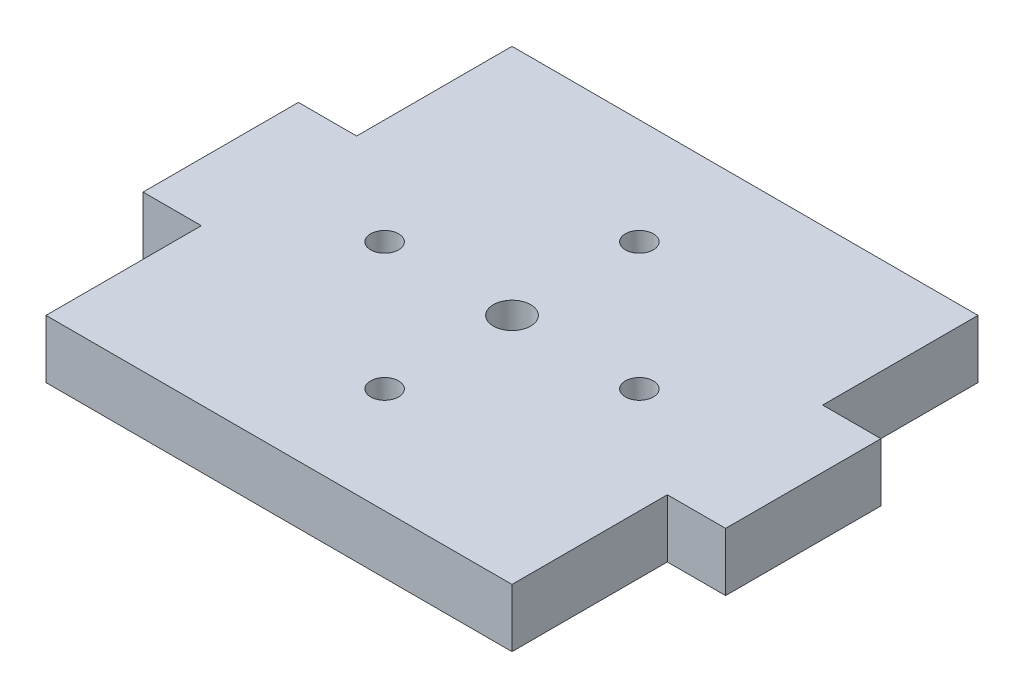
ISO-10303-21;
HEADER;
FILE_DESCRIPTION(('STEP AP214'),'2;1');
FILE_NAME('part.step','',(''),(''),'','','');
FILE_SCHEMA(('AUTOMOTIVE_DESIGN { 1 0 10303 214 1 1 1 1 }'));
ENDSEC;
DATA;
#1=APPLICATION_CONTEXT('core data for automotive mechanical design processes');
#2=APPLICATION_PROTOCOL_DEFINITION('international standard','automotive_design',2000,#1);
#3=PRODUCT_CONTEXT('',#1,'mechanical');
#4=PRODUCT('Part','Part','',(#3));
#5=PRODUCT_RELATED_PRODUCT_CATEGORY('part','',(#4));
#6=PRODUCT_DEFINITION_FORMATION('','',#4);
#7=PRODUCT_DEFINITION_CONTEXT('part definition',#1,'design');
#8=PRODUCT_DEFINITION('design','',#6,#7);
#9=PRODUCT_DEFINITION_SHAPE('','',#8);
#10=(LENGTH_UNIT() NAMED_UNIT(*) SI_UNIT(.MILLI.,.METRE.));
#11=(NAMED_UNIT(*) PLANE_ANGLE_UNIT() SI_UNIT($,.RADIAN.));
#12=(NAMED_UNIT(*) SI_UNIT($,.STERADIAN.) SOLID_ANGLE_UNIT());
#13=UNCERTAINTY_MEASURE_WITH_UNIT(LENGTH_MEASURE(1.E-05),#10,'distance_accuracy_value','');
#14=(GEOMETRIC_REPRESENTATION_CONTEXT(3) GLOBAL_UNCERTAINTY_ASSIGNED_CONTEXT((#13)) GLOBAL_UNIT_ASSIGNED_CONTEXT((#10,
#11,#12)) REPRESENTATION_CONTEXT('',''));
#15=CARTESIAN_POINT('',(0.,0.,0.));
#16=DIRECTION('',(0.,0.,1.));
#17=DIRECTION('',(1.,0.,0.));
#18=AXIS2_PLACEMENT_3D('',#15,#16,#17);
#19=CARTESIAN_POINT('',(0.,4.7625,0.));
#20=DIRECTION('',(0.,-1.,0.));
#21=DIRECTION('',(0.,0.,-1.));
#22=AXIS2_PLACEMENT_3D('',#19,#20,#21);
#23=PLANE('',#22);
#24=DIRECTION('',(1.,0.,0.));
#25=VECTOR('',#24,1.);
#26=CARTESIAN_POINT('',(38.1,4.7625,0.));
#27=LINE('',#26,#25);
#28=CARTESIAN_POINT('',(0.,4.7625,0.));
#29=VERTEX_POINT('',#28);
#30=CARTESIAN_POINT('',(38.1,4.7625,0.));
#31=VERTEX_POINT('',#30);
#32=EDGE_CURVE('E177',#29,#31,#27,.T.);
#33=ORIENTED_EDGE('',*,*,#32,.T.);
#34=DIRECTION('',(0.,0.,-1.));
#35=VECTOR('',#34,1.);
#36=CARTESIAN_POINT('',(38.1,4.7625,-12.7));
#37=LINE('',#36,#35);
#38=CARTESIAN_POINT('',(38.1,4.7625,-12.7));
#39=VERTEX_POINT('',#38);
#40=EDGE_CURVE('E105',#31,#39,#37,.T.);
#41=ORIENTED_EDGE('',*,*,#40,.T.);
#42=DIRECTION('',(1.,0.,0.));
#43=VECTOR('',#42,1.);
#44=CARTESIAN_POINT('',(42.8625,4.7625,-12.7));
#45=LINE('',#44,#43);
#46=CARTESIAN_POINT('',(42.8625,4.7625,-12.7));
#47=VERTEX_POINT('',#46);
#48=EDGE_CURVE('E204',#39,#47,#45,.T.);
#49=ORIENTED_EDGE('',*,*,#48,.T.);
#50=DIRECTION('',(0.,0.,-1.));
#51=VECTOR('',#50,1.);
#52=CARTESIAN_POINT('',(42.8625,4.7625,-25.4));
#53=LINE('',#52,#51);
#54=CARTESIAN_POINT('',(42.8625,4.7625,-25.4));
#55=VERTEX_POINT('',#54);
#56=EDGE_CURVE('E223',#47,#55,#53,.T.);
#57=ORIENTED_EDGE('',*,*,#56,.T.);
#58=DIRECTION('',(-1.,0.,0.));
#59=VECTOR('',#58,1.);
#60=CARTESIAN_POINT('',(38.1,4.7625,-25.4));
#61=LINE('',#60,#59);
#62=CARTESIAN_POINT('',(38.1,4.7625,-25.4));
#63=VERTEX_POINT('',#62);
#64=EDGE_CURVE('E220',#55,#63,#61,.T.);
#65=ORIENTED_EDGE('',*,*,#64,.T.);
#66=DIRECTION('',(0.,0.,-1.));
#67=VECTOR('',#66,1.);
#68=CARTESIAN_POINT('',(38.1,4.7625,-38.1));
#69=LINE('',#68,#67);
#70=CARTESIAN_POINT('',(38.1,4.7625,-38.1));
#71=VERTEX_POINT('',#70);
#72=EDGE_CURVE('E222',#63,#71,#69,.T.);
#73=ORIENTED_EDGE('',*,*,#72,.T.);
#74=DIRECTION('',(-1.,0.,0.));
#75=VECTOR('',#74,1.);
#76=CARTESIAN_POINT('',(0.,4.7625,-38.1));
#77=LINE('',#76,#75);
#78=CARTESIAN_POINT('',(0.,4.7625,-38.1));
#79=VERTEX_POINT('',#78);
#80=EDGE_CURVE('E225',#71,#79,#77,.T.);
#81=ORIENTED_EDGE('',*,*,#80,.T.);
#82=DIRECTION('',(0.,0.,1.));
#83=VECTOR('',#82,1.);
#84=CARTESIAN_POINT('',(0.,4.7625,-25.4));
#85=LINE('',#84,#83);
#86=CARTESIAN_POINT('',(0.,4.7625,-25.4));
#87=VERTEX_POINT('',#86);
#88=EDGE_CURVE('E231',#79,#87,#85,.T.);
#89=ORIENTED_EDGE('',*,*,#88,.T.);
#90=DIRECTION('',(-1.,0.,0.));
#91=VECTOR('',#90,1.);
#92=CARTESIAN_POINT('',(-4.7625,4.7625,-25.4));
#93=LINE('',#92,#91);
#94=CARTESIAN_POINT('',(-4.7625,4.7625,-25.4));
#95=VERTEX_POINT('',#94);
#96=EDGE_CURVE('E136',#87,#95,#93,.T.);
#97=ORIENTED_EDGE('',*,*,#96,.T.);
#98=DIRECTION('',(0.,0.,1.));
#99=VECTOR('',#98,1.);
#100=CARTESIAN_POINT('',(-4.7625,4.7625,-12.7));
#101=LINE('',#100,#99);
#102=CARTESIAN_POINT('',(-4.7625,4.7625,-12.7));
#103=VERTEX_POINT('',#102);
#104=EDGE_CURVE('E130',#95,#103,#101,.T.);
#105=ORIENTED_EDGE('',*,*,#104,.T.);
#106=DIRECTION('',(1.,0.,0.));
#107=VECTOR('',#106,1.);
#108=CARTESIAN_POINT('',(0.,4.7625,-12.7));
#109=LINE('',#108,#107);
#110=CARTESIAN_POINT('',(0.,4.7625,-12.7));
#111=VERTEX_POINT('',#110);
#112=EDGE_CURVE('E134',#103,#111,#109,.T.);
#113=ORIENTED_EDGE('',*,*,#112,.T.);
#114=DIRECTION('',(0.,0.,1.));
#115=VECTOR('',#114,1.);
#116=CARTESIAN_POINT('',(0.,4.7625,0.));
#117=LINE('',#116,#115);
#118=EDGE_CURVE('E50',#111,#29,#117,.T.);
#119=ORIENTED_EDGE('',*,*,#118,.T.);
#120=EDGE_LOOP('',(#33,#41,#49,#57,#65,#73,#81,#89,#97,#105,#113,#119));
#121=FACE_BOUND('',#120,.T.);
#122=CARTESIAN_POINT('',(19.05,4.7625,-19.05));
#123=DIRECTION('',(0.,1.,0.));
#124=DIRECTION('',(0.,0.,1.));
#125=AXIS2_PLACEMENT_3D('',#122,#123,#124);
#126=CIRCLE('',#125,1.524);
#127=CARTESIAN_POINT('',(19.05,4.7625,-20.574));
#128=VERTEX_POINT('',#127);
#129=EDGE_CURVE('E158',#128,#128,#126,.T.);
#130=ORIENTED_EDGE('',*,*,#129,.F.);
#131=EDGE_LOOP('',(#130));
#132=FACE_BOUND('',#131,.T.);
#133=CARTESIAN_POINT('',(29.464,4.7625,-19.05));
#134=DIRECTION('',(0.,1.,0.));
#135=DIRECTION('',(0.,0.,1.));
#136=AXIS2_PLACEMENT_3D('',#133,#134,#135);
#137=CIRCLE('',#136,1.143);
#138=CARTESIAN_POINT('',(29.464,4.7625,-20.193));
#139=VERTEX_POINT('',#138);
#140=EDGE_CURVE('E305',#139,#139,#137,.T.);
#141=ORIENTED_EDGE('',*,*,#140,.F.);
#142=EDGE_LOOP('',(#141));
#143=FACE_BOUND('',#142,.T.);
#144=CARTESIAN_POINT('',(19.05,4.7625,-8.63599999999999));
#145=DIRECTION('',(0.,1.,0.));
#146=DIRECTION('',(0.,0.,1.));
#147=AXIS2_PLACEMENT_3D('',#144,#145,#146);
#148=CIRCLE('',#147,1.143);
#149=CARTESIAN_POINT('',(19.05,4.7625,-9.77899999999999));
#150=VERTEX_POINT('',#149);
#151=EDGE_CURVE('E299',#150,#150,#148,.T.);
#152=ORIENTED_EDGE('',*,*,#151,.F.);
#153=EDGE_LOOP('',(#152));
#154=FACE_BOUND('',#153,.T.);
#155=CARTESIAN_POINT('',(8.63599999999999,4.7625,-19.05));
#156=DIRECTION('',(0.,1.,0.));
#157=DIRECTION('',(0.,0.,1.));
#158=AXIS2_PLACEMENT_3D('',#155,#156,#157);
#159=CIRCLE('',#158,1.143);
#160=CARTESIAN_POINT('',(8.63599999999999,4.7625,-20.193));
#161=VERTEX_POINT('',#160);
#162=EDGE_CURVE('E293',#161,#161,#159,.T.);
#163=ORIENTED_EDGE('',*,*,#162,.F.);
#164=EDGE_LOOP('',(#163));
#165=FACE_BOUND('',#164,.T.);
#166=CARTESIAN_POINT('',(19.05,4.7625,-29.464));
#167=DIRECTION('',(0.,1.,0.));
#168=DIRECTION('',(0.,0.,1.));
#169=AXIS2_PLACEMENT_3D('',#166,#167,#168);
#170=CIRCLE('',#169,1.143);
#171=CARTESIAN_POINT('',(19.05,4.7625,-30.607));
#172=VERTEX_POINT('',#171);
#173=EDGE_CURVE('E284',#172,#172,#170,.T.);
#174=ORIENTED_EDGE('',*,*,#173,.F.);
#175=EDGE_LOOP('',(#174));
#176=FACE_BOUND('',#175,.T.);
#177=ADVANCED_FACE('F33',(#121,#132,#143,#154,#165,#176),#23,.F.);
#178=CARTESIAN_POINT('',(0.,0.,0.));
#179=DIRECTION('',(0.,-1.,0.));
#180=DIRECTION('',(0.,0.,-1.));
#181=AXIS2_PLACEMENT_3D('',#178,#179,#180);
#182=PLANE('',#181);
#183=CARTESIAN_POINT('',(8.63599999999999,0.,-19.05));
#184=DIRECTION('',(0.,1.,0.));
#185=DIRECTION('',(0.,0.,1.));
#186=AXIS2_PLACEMENT_3D('',#183,#184,#185);
#187=CIRCLE('',#186,1.143);
#188=CARTESIAN_POINT('',(8.63599999999999,0.,-20.193));
#189=VERTEX_POINT('',#188);
#190=EDGE_CURVE('E290',#189,#189,#187,.T.);
#191=ORIENTED_EDGE('',*,*,#190,.T.);
#192=EDGE_LOOP('',(#191));
#193=FACE_BOUND('',#192,.T.);
#194=CARTESIAN_POINT('',(29.464,0.,-19.05));
#195=DIRECTION('',(0.,1.,0.));
#196=DIRECTION('',(0.,0.,1.));
#197=AXIS2_PLACEMENT_3D('',#194,#195,#196);
#198=CIRCLE('',#197,1.143);
#199=CARTESIAN_POINT('',(29.464,0.,-20.193));
#200=VERTEX_POINT('',#199);
#201=EDGE_CURVE('E302',#200,#200,#198,.T.);
#202=ORIENTED_EDGE('',*,*,#201,.T.);
#203=EDGE_LOOP('',(#202));
#204=FACE_BOUND('',#203,.T.);
#205=DIRECTION('',(1.,0.,0.));
#206=VECTOR('',#205,1.);
#207=CARTESIAN_POINT('',(38.1,0.,0.));
#208=LINE('',#207,#206);
#209=CARTESIAN_POINT('',(0.,0.,0.));
#210=VERTEX_POINT('',#209);
#211=CARTESIAN_POINT('',(38.1,0.,0.));
#212=VERTEX_POINT('',#211);
#213=EDGE_CURVE('E154',#210,#212,#208,.T.);
#214=ORIENTED_EDGE('',*,*,#213,.F.);
#215=DIRECTION('',(0.,0.,1.));
#216=VECTOR('',#215,1.);
#217=CARTESIAN_POINT('',(0.,0.,0.));
#218=LINE('',#217,#216);
#219=CARTESIAN_POINT('',(0.,0.,-12.7));
#220=VERTEX_POINT('',#219);
#221=EDGE_CURVE('E97',#220,#210,#218,.T.);
#222=ORIENTED_EDGE('',*,*,#221,.F.);
#223=DIRECTION('',(1.,0.,0.));
#224=VECTOR('',#223,1.);
#225=CARTESIAN_POINT('',(0.,0.,-12.7));
#226=LINE('',#225,#224);
#227=CARTESIAN_POINT('',(-4.7625,0.,-12.7));
#228=VERTEX_POINT('',#227);
#229=EDGE_CURVE('E91',#228,#220,#226,.T.);
#230=ORIENTED_EDGE('',*,*,#229,.F.);
#231=DIRECTION('',(0.,0.,1.));
#232=VECTOR('',#231,1.);
#233=CARTESIAN_POINT('',(-4.7625,0.,-12.7));
#234=LINE('',#233,#232);
#235=CARTESIAN_POINT('',(-4.7625,0.,-25.4));
#236=VERTEX_POINT('',#235);
#237=EDGE_CURVE('E144',#236,#228,#234,.T.);
#238=ORIENTED_EDGE('',*,*,#237,.F.);
#239=DIRECTION('',(-1.,0.,0.));
#240=VECTOR('',#239,1.);
#241=CARTESIAN_POINT('',(-4.7625,0.,-25.4));
#242=LINE('',#241,#240);
#243=CARTESIAN_POINT('',(0.,0.,-25.4));
#244=VERTEX_POINT('',#243);
#245=EDGE_CURVE('E172',#244,#236,#242,.T.);
#246=ORIENTED_EDGE('',*,*,#245,.F.);
#247=DIRECTION('',(0.,0.,1.));
#248=VECTOR('',#247,1.);
#249=CARTESIAN_POINT('',(0.,0.,-25.4));
#250=LINE('',#249,#248);
#251=CARTESIAN_POINT('',(0.,0.,-38.1));
#252=VERTEX_POINT('',#251);
#253=EDGE_CURVE('E170',#252,#244,#250,.T.);
#254=ORIENTED_EDGE('',*,*,#253,.F.);
#255=DIRECTION('',(-1.,0.,0.));
#256=VECTOR('',#255,1.);
#257=CARTESIAN_POINT('',(0.,0.,-38.1));
#258=LINE('',#257,#256);
#259=CARTESIAN_POINT('',(38.1,0.,-38.1));
#260=VERTEX_POINT('',#259);
#261=EDGE_CURVE('E168',#260,#252,#258,.T.);
#262=ORIENTED_EDGE('',*,*,#261,.F.);
#263=DIRECTION('',(0.,0.,-1.));
#264=VECTOR('',#263,1.);
#265=CARTESIAN_POINT('',(38.1,0.,-38.1));
#266=LINE('',#265,#264);
#267=CARTESIAN_POINT('',(38.1,0.,-25.4));
#268=VERTEX_POINT('',#267);
#269=EDGE_CURVE('E166',#268,#260,#266,.T.);
#270=ORIENTED_EDGE('',*,*,#269,.F.);
#271=DIRECTION('',(-1.,0.,0.));
#272=VECTOR('',#271,1.);
#273=CARTESIAN_POINT('',(38.1,0.,-25.4));
#274=LINE('',#273,#272);
#275=CARTESIAN_POINT('',(42.8625,0.,-25.4));
#276=VERTEX_POINT('',#275);
#277=EDGE_CURVE('E164',#276,#268,#274,.T.);
#278=ORIENTED_EDGE('',*,*,#277,.F.);
#279=DIRECTION('',(0.,0.,-1.));
#280=VECTOR('',#279,1.);
#281=CARTESIAN_POINT('',(42.8625,0.,-25.4));
#282=LINE('',#281,#280);
#283=CARTESIAN_POINT('',(42.8625,0.,-12.7));
#284=VERTEX_POINT('',#283);
#285=EDGE_CURVE('E162',#284,#276,#282,.T.);
#286=ORIENTED_EDGE('',*,*,#285,.F.);
#287=DIRECTION('',(1.,0.,0.));
#288=VECTOR('',#287,1.);
#289=CARTESIAN_POINT('',(42.8625,0.,-12.7));
#290=LINE('',#289,#288);
#291=CARTESIAN_POINT('',(38.1,0.,-12.7));
#292=VERTEX_POINT('',#291);
#293=EDGE_CURVE('E160',#292,#284,#290,.T.);
#294=ORIENTED_EDGE('',*,*,#293,.F.);
#295=DIRECTION('',(0.,0.,-1.));
#296=VECTOR('',#295,1.);
#297=CARTESIAN_POINT('',(38.1,0.,-12.7));
#298=LINE('',#297,#296);
#299=EDGE_CURVE('E157',#212,#292,#298,.T.);
#300=ORIENTED_EDGE('',*,*,#299,.F.);
#301=EDGE_LOOP('',(#214,#222,#230,#238,#246,#254,#262,#270,#278,#286,#294,#300));
#302=FACE_BOUND('',#301,.T.);
#303=CARTESIAN_POINT('',(19.05,0.,-19.05));
#304=DIRECTION('',(0.,1.,0.));
#305=DIRECTION('',(0.,0.,1.));
#306=AXIS2_PLACEMENT_3D('',#303,#304,#305);
#307=CIRCLE('',#306,1.524);
#308=CARTESIAN_POINT('',(19.05,0.,-20.574));
#309=VERTEX_POINT('',#308);
#310=EDGE_CURVE('E308',#309,#309,#307,.T.);
#311=ORIENTED_EDGE('',*,*,#310,.T.);
#312=EDGE_LOOP('',(#311));
#313=FACE_BOUND('',#312,.T.);
#314=CARTESIAN_POINT('',(19.05,0.,-8.63599999999999));
#315=DIRECTION('',(0.,1.,0.));
#316=DIRECTION('',(0.,0.,1.));
#317=AXIS2_PLACEMENT_3D('',#314,#315,#316);
#318=CIRCLE('',#317,1.143);
#319=CARTESIAN_POINT('',(19.05,0.,-9.77899999999999));
#320=VERTEX_POINT('',#319);
#321=EDGE_CURVE('E296',#320,#320,#318,.T.);
#322=ORIENTED_EDGE('',*,*,#321,.T.);
#323=EDGE_LOOP('',(#322));
#324=FACE_BOUND('',#323,.T.);
#325=CARTESIAN_POINT('',(19.05,0.,-29.464));
#326=DIRECTION('',(0.,1.,0.));
#327=DIRECTION('',(0.,0.,1.));
#328=AXIS2_PLACEMENT_3D('',#325,#326,#327);
#329=CIRCLE('',#328,1.143);
#330=CARTESIAN_POINT('',(19.05,0.,-30.607));
#331=VERTEX_POINT('',#330);
#332=EDGE_CURVE('E287',#331,#331,#329,.T.);
#333=ORIENTED_EDGE('',*,*,#332,.T.);
#334=EDGE_LOOP('',(#333));
#335=FACE_BOUND('',#334,.T.);
#336=ADVANCED_FACE('F208',(#193,#204,#302,#313,#324,#335),#182,.T.);
#337=CARTESIAN_POINT('',(38.1,4.7625,0.));
#338=DIRECTION('',(0.,0.,-1.));
#339=DIRECTION('',(-1.,0.,0.));
#340=AXIS2_PLACEMENT_3D('',#337,#338,#339);
#341=PLANE('',#340);
#342=ORIENTED_EDGE('',*,*,#213,.T.);
#343=DIRECTION('',(0.,-1.,0.));
#344=VECTOR('',#343,1.);
#345=CARTESIAN_POINT('',(38.1,4.7625,0.));
#346=LINE('',#345,#344);
#347=EDGE_CURVE('E11',#31,#212,#346,.T.);
#348=ORIENTED_EDGE('',*,*,#347,.F.);
#349=ORIENTED_EDGE('',*,*,#32,.F.);
#350=DIRECTION('',(0.,-1.,0.));
#351=VECTOR('',#350,1.);
#352=CARTESIAN_POINT('',(0.,4.7625,0.));
#353=LINE('',#352,#351);
#354=EDGE_CURVE('E150',#29,#210,#353,.T.);
#355=ORIENTED_EDGE('',*,*,#354,.T.);
#356=EDGE_LOOP('',(#342,#348,#349,#355));
#357=FACE_BOUND('',#356,.T.);
#358=ADVANCED_FACE('F35',(#357),#341,.F.);
#359=CARTESIAN_POINT('',(38.1,4.7625,-12.7));
#360=DIRECTION('',(-1.,0.,0.));
#361=DIRECTION('',(0.,0.,1.));
#362=AXIS2_PLACEMENT_3D('',#359,#360,#361);
#363=PLANE('',#362);
#364=ORIENTED_EDGE('',*,*,#299,.T.);
#365=DIRECTION('',(0.,-1.,0.));
#366=VECTOR('',#365,1.);
#367=CARTESIAN_POINT('',(38.1,4.7625,-12.7));
#368=LINE('',#367,#366);
#369=EDGE_CURVE('E42',#39,#292,#368,.T.);
#370=ORIENTED_EDGE('',*,*,#369,.F.);
#371=ORIENTED_EDGE('',*,*,#40,.F.);
#372=ORIENTED_EDGE('',*,*,#347,.T.);
#373=EDGE_LOOP('',(#364,#370,#371,#372));
#374=FACE_BOUND('',#373,.T.);
#375=ADVANCED_FACE('F429',(#374),#363,.F.);
#376=CARTESIAN_POINT('',(42.8625,4.7625,-12.7));
#377=DIRECTION('',(0.,0.,-1.));
#378=DIRECTION('',(-1.,0.,0.));
#379=AXIS2_PLACEMENT_3D('',#376,#377,#378);
#380=PLANE('',#379);
#381=ORIENTED_EDGE('',*,*,#293,.T.);
#382=DIRECTION('',(0.,-1.,0.));
#383=VECTOR('',#382,1.);
#384=CARTESIAN_POINT('',(42.8625,4.7625,-12.7));
#385=LINE('',#384,#383);
#386=EDGE_CURVE('E196',#47,#284,#385,.T.);
#387=ORIENTED_EDGE('',*,*,#386,.F.);
#388=ORIENTED_EDGE('',*,*,#48,.F.);
#389=ORIENTED_EDGE('',*,*,#369,.T.);
#390=EDGE_LOOP('',(#381,#387,#388,#389));
#391=FACE_BOUND('',#390,.T.);
#392=ADVANCED_FACE('F202',(#391),#380,.F.);
#393=CARTESIAN_POINT('',(42.8625,4.7625,-25.4));
#394=DIRECTION('',(-1.,0.,0.));
#395=DIRECTION('',(0.,0.,1.));
#396=AXIS2_PLACEMENT_3D('',#393,#394,#395);
#397=PLANE('',#396);
#398=ORIENTED_EDGE('',*,*,#285,.T.);
#399=DIRECTION('',(0.,-1.,0.));
#400=VECTOR('',#399,1.);
#401=CARTESIAN_POINT('',(42.8625,4.7625,-25.4));
#402=LINE('',#401,#400);
#403=EDGE_CURVE('E193',#55,#276,#402,.T.);
#404=ORIENTED_EDGE('',*,*,#403,.F.);
#405=ORIENTED_EDGE('',*,*,#56,.F.);
#406=ORIENTED_EDGE('',*,*,#386,.T.);
#407=EDGE_LOOP('',(#398,#404,#405,#406));
#408=FACE_BOUND('',#407,.T.);
#409=ADVANCED_FACE('F214',(#408),#397,.F.);
#410=CARTESIAN_POINT('',(38.1,4.7625,-25.4));
#411=DIRECTION('',(0.,0.,1.));
#412=DIRECTION('',(1.,0.,0.));
#413=AXIS2_PLACEMENT_3D('',#410,#411,#412);
#414=PLANE('',#413);
#415=ORIENTED_EDGE('',*,*,#277,.T.);
#416=DIRECTION('',(0.,-1.,0.));
#417=VECTOR('',#416,1.);
#418=CARTESIAN_POINT('',(38.1,4.7625,-25.4));
#419=LINE('',#418,#417);
#420=EDGE_CURVE('E190',#63,#268,#419,.T.);
#421=ORIENTED_EDGE('',*,*,#420,.F.);
#422=ORIENTED_EDGE('',*,*,#64,.F.);
#423=ORIENTED_EDGE('',*,*,#403,.T.);
#424=EDGE_LOOP('',(#415,#421,#422,#423));
#425=FACE_BOUND('',#424,.T.);
#426=ADVANCED_FACE('F218',(#425),#414,.F.);
#427=CARTESIAN_POINT('',(38.1,4.7625,-38.1));
#428=DIRECTION('',(-1.,0.,0.));
#429=DIRECTION('',(0.,0.,1.));
#430=AXIS2_PLACEMENT_3D('',#427,#428,#429);
#431=PLANE('',#430);
#432=ORIENTED_EDGE('',*,*,#269,.T.);
#433=DIRECTION('',(0.,-1.,0.));
#434=VECTOR('',#433,1.);
#435=CARTESIAN_POINT('',(38.1,4.7625,-38.1));
#436=LINE('',#435,#434);
#437=EDGE_CURVE('E187',#71,#260,#436,.T.);
#438=ORIENTED_EDGE('',*,*,#437,.F.);
#439=ORIENTED_EDGE('',*,*,#72,.F.);
#440=ORIENTED_EDGE('',*,*,#420,.T.);
#441=EDGE_LOOP('',(#432,#438,#439,#440));
#442=FACE_BOUND('',#441,.T.);
#443=ADVANCED_FACE('F394',(#442),#431,.F.);
#444=CARTESIAN_POINT('',(0.,4.7625,-38.1));
#445=DIRECTION('',(0.,0.,1.));
#446=DIRECTION('',(1.,0.,0.));
#447=AXIS2_PLACEMENT_3D('',#444,#445,#446);
#448=PLANE('',#447);
#449=ORIENTED_EDGE('',*,*,#261,.T.);
#450=DIRECTION('',(0.,-1.,0.));
#451=VECTOR('',#450,1.);
#452=CARTESIAN_POINT('',(0.,4.7625,-38.1));
#453=LINE('',#452,#451);
#454=EDGE_CURVE('E184',#79,#252,#453,.T.);
#455=ORIENTED_EDGE('',*,*,#454,.F.);
#456=ORIENTED_EDGE('',*,*,#80,.F.);
#457=ORIENTED_EDGE('',*,*,#437,.T.);
#458=EDGE_LOOP('',(#449,#455,#456,#457));
#459=FACE_BOUND('',#458,.T.);
#460=ADVANCED_FACE('F385',(#459),#448,.F.);
#461=CARTESIAN_POINT('',(0.,4.7625,-25.4));
#462=DIRECTION('',(1.,0.,0.));
#463=DIRECTION('',(0.,0.,-1.));
#464=AXIS2_PLACEMENT_3D('',#461,#462,#463);
#465=PLANE('',#464);
#466=ORIENTED_EDGE('',*,*,#253,.T.);
#467=DIRECTION('',(0.,-1.,0.));
#468=VECTOR('',#467,1.);
#469=CARTESIAN_POINT('',(0.,4.7625,-25.4));
#470=LINE('',#469,#468);
#471=EDGE_CURVE('E181',#87,#244,#470,.T.);
#472=ORIENTED_EDGE('',*,*,#471,.F.);
#473=ORIENTED_EDGE('',*,*,#88,.F.);
#474=ORIENTED_EDGE('',*,*,#454,.T.);
#475=EDGE_LOOP('',(#466,#472,#473,#474));
#476=FACE_BOUND('',#475,.T.);
#477=ADVANCED_FACE('F237',(#476),#465,.F.);
#478=CARTESIAN_POINT('',(-4.7625,4.7625,-25.4));
#479=DIRECTION('',(0.,0.,1.));
#480=DIRECTION('',(1.,0.,0.));
#481=AXIS2_PLACEMENT_3D('',#478,#479,#480);
#482=PLANE('',#481);
#483=ORIENTED_EDGE('',*,*,#245,.T.);
#484=DIRECTION('',(0.,-1.,0.));
#485=VECTOR('',#484,1.);
#486=CARTESIAN_POINT('',(-4.7625,4.7625,-25.4));
#487=LINE('',#486,#485);
#488=EDGE_CURVE('E145',#95,#236,#487,.T.);
#489=ORIENTED_EDGE('',*,*,#488,.F.);
#490=ORIENTED_EDGE('',*,*,#96,.F.);
#491=ORIENTED_EDGE('',*,*,#471,.T.);
#492=EDGE_LOOP('',(#483,#489,#490,#491));
#493=FACE_BOUND('',#492,.T.);
#494=ADVANCED_FACE('F241',(#493),#482,.F.);
#495=CARTESIAN_POINT('',(-4.7625,4.7625,-12.7));
#496=DIRECTION('',(1.,0.,0.));
#497=DIRECTION('',(0.,0.,-1.));
#498=AXIS2_PLACEMENT_3D('',#495,#496,#497);
#499=PLANE('',#498);
#500=ORIENTED_EDGE('',*,*,#237,.T.);
#501=DIRECTION('',(0.,-1.,0.));
#502=VECTOR('',#501,1.);
#503=CARTESIAN_POINT('',(-4.7625,4.7625,-12.7));
#504=LINE('',#503,#502);
#505=EDGE_CURVE('E141',#103,#228,#504,.T.);
#506=ORIENTED_EDGE('',*,*,#505,.F.);
#507=ORIENTED_EDGE('',*,*,#104,.F.);
#508=ORIENTED_EDGE('',*,*,#488,.T.);
#509=EDGE_LOOP('',(#500,#506,#507,#508));
#510=FACE_BOUND('',#509,.T.);
#511=ADVANCED_FACE('F142',(#510),#499,.F.);
#512=CARTESIAN_POINT('',(0.,4.7625,-12.7));
#513=DIRECTION('',(0.,0.,-1.));
#514=DIRECTION('',(-1.,0.,0.));
#515=AXIS2_PLACEMENT_3D('',#512,#513,#514);
#516=PLANE('',#515);
#517=ORIENTED_EDGE('',*,*,#229,.T.);
#518=DIRECTION('',(0.,-1.,0.));
#519=VECTOR('',#518,1.);
#520=CARTESIAN_POINT('',(0.,4.7625,-12.7));
#521=LINE('',#520,#519);
#522=EDGE_CURVE('E146',#111,#220,#521,.T.);
#523=ORIENTED_EDGE('',*,*,#522,.F.);
#524=ORIENTED_EDGE('',*,*,#112,.F.);
#525=ORIENTED_EDGE('',*,*,#505,.T.);
#526=EDGE_LOOP('',(#517,#523,#524,#525));
#527=FACE_BOUND('',#526,.T.);
#528=ADVANCED_FACE('F148',(#527),#516,.F.);
#529=CARTESIAN_POINT('',(0.,4.7625,0.));
#530=DIRECTION('',(1.,0.,0.));
#531=DIRECTION('',(0.,0.,-1.));
#532=AXIS2_PLACEMENT_3D('',#529,#530,#531);
#533=PLANE('',#532);
#534=ORIENTED_EDGE('',*,*,#221,.T.);
#535=ORIENTED_EDGE('',*,*,#354,.F.);
#536=ORIENTED_EDGE('',*,*,#118,.F.);
#537=ORIENTED_EDGE('',*,*,#522,.T.);
#538=EDGE_LOOP('',(#534,#535,#536,#537));
#539=FACE_BOUND('',#538,.T.);
#540=ADVANCED_FACE('F245',(#539),#533,.F.);
#541=CARTESIAN_POINT('',(19.05,4.7625,-19.05));
#542=DIRECTION('',(0.,-1.,0.));
#543=DIRECTION('',(0.,0.,-1.));
#544=AXIS2_PLACEMENT_3D('',#541,#542,#543);
#545=CYLINDRICAL_SURFACE('',#544,1.524);
#546=CARTESIAN_POINT('',(19.05,4.7625,-20.574));
#547=CARTESIAN_POINT('',(19.05,4.712890625,-20.574));
#548=CARTESIAN_POINT('',(19.05,4.66328125,-20.574));
#549=CARTESIAN_POINT('',(19.05,4.5640625,-20.574));
#550=CARTESIAN_POINT('',(19.05,4.514453125,-20.574));
#551=CARTESIAN_POINT('',(19.05,4.415234375,-20.574));
#552=CARTESIAN_POINT('',(19.05,4.365625,-20.574));
#553=CARTESIAN_POINT('',(19.05,4.26640625,-20.574));
#554=CARTESIAN_POINT('',(19.05,4.216796875,-20.574));
#555=CARTESIAN_POINT('',(19.05,4.117578125,-20.574));
#556=CARTESIAN_POINT('',(19.05,4.06796875,-20.574));
#557=CARTESIAN_POINT('',(19.05,3.96875,-20.574));
#558=CARTESIAN_POINT('',(19.05,3.919140625,-20.574));
#559=CARTESIAN_POINT('',(19.05,3.819921875,-20.574));
#560=CARTESIAN_POINT('',(19.05,3.7703125,-20.574));
#561=CARTESIAN_POINT('',(19.05,3.67109375,-20.574));
#562=CARTESIAN_POINT('',(19.05,3.621484375,-20.574));
#563=CARTESIAN_POINT('',(19.05,3.522265625,-20.574));
#564=CARTESIAN_POINT('',(19.05,3.47265625,-20.574));
#565=CARTESIAN_POINT('',(19.05,3.3734375,-20.574));
#566=CARTESIAN_POINT('',(19.05,3.323828125,-20.574));
#567=CARTESIAN_POINT('',(19.05,3.224609375,-20.574));
#568=CARTESIAN_POINT('',(19.05,3.175,-20.574));
#569=CARTESIAN_POINT('',(19.05,3.07578125,-20.574));
#570=CARTESIAN_POINT('',(19.05,3.026171875,-20.574));
#571=CARTESIAN_POINT('',(19.05,2.926953125,-20.574));
#572=CARTESIAN_POINT('',(19.05,2.87734375,-20.574));
#573=CARTESIAN_POINT('',(19.05,2.778125,-20.574));
#574=CARTESIAN_POINT('',(19.05,2.728515625,-20.574));
#575=CARTESIAN_POINT('',(19.05,2.629296875,-20.574));
#576=CARTESIAN_POINT('',(19.05,2.5796875,-20.574));
#577=CARTESIAN_POINT('',(19.05,2.48046875,-20.574));
#578=CARTESIAN_POINT('',(19.05,2.430859375,-20.574));
#579=CARTESIAN_POINT('',(19.05,2.331640625,-20.574));
#580=CARTESIAN_POINT('',(19.05,2.28203125,-20.574));
#581=CARTESIAN_POINT('',(19.05,2.1828125,-20.574));
#582=CARTESIAN_POINT('',(19.05,2.133203125,-20.574));
#583=CARTESIAN_POINT('',(19.05,2.033984375,-20.574));
#584=CARTESIAN_POINT('',(19.05,1.984375,-20.574));
#585=CARTESIAN_POINT('',(19.05,1.88515625,-20.574));
#586=CARTESIAN_POINT('',(19.05,1.835546875,-20.574));
#587=CARTESIAN_POINT('',(19.05,1.736328125,-20.574));
#588=CARTESIAN_POINT('',(19.05,1.68671875,-20.574));
#589=CARTESIAN_POINT('',(19.05,1.5875,-20.574));
#590=CARTESIAN_POINT('',(19.05,1.537890625,-20.574));
#591=CARTESIAN_POINT('',(19.05,1.438671875,-20.574));
#592=CARTESIAN_POINT('',(19.05,1.3890625,-20.574));
#593=CARTESIAN_POINT('',(19.05,1.28984375,-20.574));
#594=CARTESIAN_POINT('',(19.05,1.240234375,-20.574));
#595=CARTESIAN_POINT('',(19.05,1.141015625,-20.574));
#596=CARTESIAN_POINT('',(19.05,1.09140625,-20.574));
#597=CARTESIAN_POINT('',(19.05,0.992187499999999,-20.574));
#598=CARTESIAN_POINT('',(19.05,0.942578124999999,-20.574));
#599=CARTESIAN_POINT('',(19.05,0.843359375,-20.574));
#600=CARTESIAN_POINT('',(19.05,0.79375,-20.574));
#601=CARTESIAN_POINT('',(19.05,0.69453125,-20.574));
#602=CARTESIAN_POINT('',(19.05,0.644921875,-20.574));
#603=CARTESIAN_POINT('',(19.05,0.545703125,-20.574));
#604=CARTESIAN_POINT('',(19.05,0.49609375,-20.574));
#605=CARTESIAN_POINT('',(19.05,0.396875,-20.574));
#606=CARTESIAN_POINT('',(19.05,0.347265625,-20.574));
#607=CARTESIAN_POINT('',(19.05,0.248046875,-20.574));
#608=CARTESIAN_POINT('',(19.05,0.1984375,-20.574));
#609=CARTESIAN_POINT('',(19.05,0.09921875,-20.574));
#610=CARTESIAN_POINT('',(19.05,0.049609375,-20.574));
#611=CARTESIAN_POINT('',(19.05,0.,-20.574));
#612=B_SPLINE_CURVE_WITH_KNOTS('',3,(#546,#547,#548,#549,#550,#551,#552,#553,#554,#555,#556,
#557,#558,#559,#560,#561,#562,#563,#564,#565,#566,#567,#568,#569,#570,#571,#572,#573,#574,#575,
#576,#577,#578,#579,#580,#581,#582,#583,#584,#585,#586,#587,#588,#589,#590,#591,#592,#593,#594,
#595,#596,#597,#598,#599,#600,#601,#602,#603,#604,#605,#606,#607,#608,#609,#610,#611),
.UNSPECIFIED.,.F.,.F.,(4,2,2,2,2,2,2,2,2,2,2,2,2,2,2,2,2,2,2,2,2,2,2,2,2,2,2,2,2,2,2,2,4),(0.,
0.148828125,0.29765625,0.446484375,0.5953125,0.744140625,0.892968750000001,1.041796875,1.190625,
1.339453125,1.48828125,1.637109375,1.7859375,1.934765625,2.08359375,2.232421875,2.38125,
2.530078125,2.67890625,2.827734375,2.9765625,3.125390625,3.27421875,3.423046875,3.571875,
3.720703125,3.86953125,4.018359375,4.1671875,4.316015625,4.46484375,4.613671875,4.7625),.UNSPECIFIED.);
#613=EDGE_CURVE('BSEAM247',#128,#309,#612,.T.);
#614=ORIENTED_EDGE('',*,*,#129,.T.);
#615=ORIENTED_EDGE('',*,*,#310,.F.);
#616=ORIENTED_EDGE('',*,*,#613,.T.);
#617=ORIENTED_EDGE('',*,*,#613,.F.);
#618=EDGE_LOOP('',(#614,#616,#615,#617));
#619=FACE_BOUND('',#618,.T.);
#620=ADVANCED_FACE('F247',(#619),#545,.F.);
#621=CARTESIAN_POINT('',(29.464,4.7625,-19.05));
#622=DIRECTION('',(0.,-1.,0.));
#623=DIRECTION('',(0.,0.,-1.));
#624=AXIS2_PLACEMENT_3D('',#621,#622,#623);
#625=CYLINDRICAL_SURFACE('',#624,1.143);
#626=CARTESIAN_POINT('',(29.464,4.7625,-20.193));
#627=CARTESIAN_POINT('',(29.464,4.712890625,-20.193));
#628=CARTESIAN_POINT('',(29.464,4.66328125,-20.193));
#629=CARTESIAN_POINT('',(29.464,4.5640625,-20.193));
#630=CARTESIAN_POINT('',(29.464,4.514453125,-20.193));
#631=CARTESIAN_POINT('',(29.464,4.415234375,-20.193));
#632=CARTESIAN_POINT('',(29.464,4.365625,-20.193));
#633=CARTESIAN_POINT('',(29.464,4.26640625,-20.193));
#634=CARTESIAN_POINT('',(29.464,4.216796875,-20.193));
#635=CARTESIAN_POINT('',(29.464,4.117578125,-20.193));
#636=CARTESIAN_POINT('',(29.464,4.06796875,-20.193));
#637=CARTESIAN_POINT('',(29.464,3.96875,-20.193));
#638=CARTESIAN_POINT('',(29.464,3.919140625,-20.193));
#639=CARTESIAN_POINT('',(29.464,3.819921875,-20.193));
#640=CARTESIAN_POINT('',(29.464,3.7703125,-20.193));
#641=CARTESIAN_POINT('',(29.464,3.67109375,-20.193));
#642=CARTESIAN_POINT('',(29.464,3.621484375,-20.193));
#643=CARTESIAN_POINT('',(29.464,3.522265625,-20.193));
#644=CARTESIAN_POINT('',(29.464,3.47265625,-20.193));
#645=CARTESIAN_POINT('',(29.464,3.3734375,-20.193));
#646=CARTESIAN_POINT('',(29.464,3.323828125,-20.193));
#647=CARTESIAN_POINT('',(29.464,3.224609375,-20.193));
#648=CARTESIAN_POINT('',(29.464,3.175,-20.193));
#649=CARTESIAN_POINT('',(29.464,3.07578125,-20.193));
#650=CARTESIAN_POINT('',(29.464,3.026171875,-20.193));
#651=CARTESIAN_POINT('',(29.464,2.926953125,-20.193));
#652=CARTESIAN_POINT('',(29.464,2.87734375,-20.193));
#653=CARTESIAN_POINT('',(29.464,2.778125,-20.193));
#654=CARTESIAN_POINT('',(29.464,2.728515625,-20.193));
#655=CARTESIAN_POINT('',(29.464,2.629296875,-20.193));
#656=CARTESIAN_POINT('',(29.464,2.5796875,-20.193));
#657=CARTESIAN_POINT('',(29.464,2.48046875,-20.193));
#658=CARTESIAN_POINT('',(29.464,2.430859375,-20.193));
#659=CARTESIAN_POINT('',(29.464,2.331640625,-20.193));
#660=CARTESIAN_POINT('',(29.464,2.28203125,-20.193));
#661=CARTESIAN_POINT('',(29.464,2.1828125,-20.193));
#662=CARTESIAN_POINT('',(29.464,2.133203125,-20.193));
#663=CARTESIAN_POINT('',(29.464,2.033984375,-20.193));
#664=CARTESIAN_POINT('',(29.464,1.984375,-20.193));
#665=CARTESIAN_POINT('',(29.464,1.88515625,-20.193));
#666=CARTESIAN_POINT('',(29.464,1.835546875,-20.193));
#667=CARTESIAN_POINT('',(29.464,1.736328125,-20.193));
#668=CARTESIAN_POINT('',(29.464,1.68671875,-20.193));
#669=CARTESIAN_POINT('',(29.464,1.5875,-20.193));
#670=CARTESIAN_POINT('',(29.464,1.537890625,-20.193));
#671=CARTESIAN_POINT('',(29.464,1.438671875,-20.193));
#672=CARTESIAN_POINT('',(29.464,1.3890625,-20.193));
#673=CARTESIAN_POINT('',(29.464,1.28984375,-20.193));
#674=CARTESIAN_POINT('',(29.464,1.240234375,-20.193));
#675=CARTESIAN_POINT('',(29.464,1.141015625,-20.193));
#676=CARTESIAN_POINT('',(29.464,1.09140625,-20.193));
#677=CARTESIAN_POINT('',(29.464,0.9921875,-20.193));
#678=CARTESIAN_POINT('',(29.464,0.942578125,-20.193));
#679=CARTESIAN_POINT('',(29.464,0.843359375,-20.193));
#680=CARTESIAN_POINT('',(29.464,0.79375,-20.193));
#681=CARTESIAN_POINT('',(29.464,0.69453125,-20.193));
#682=CARTESIAN_POINT('',(29.464,0.644921875,-20.193));
#683=CARTESIAN_POINT('',(29.464,0.545703125,-20.193));
#684=CARTESIAN_POINT('',(29.464,0.49609375,-20.193));
#685=CARTESIAN_POINT('',(29.464,0.396875,-20.193));
#686=CARTESIAN_POINT('',(29.464,0.347265625,-20.193));
#687=CARTESIAN_POINT('',(29.464,0.248046875,-20.193));
#688=CARTESIAN_POINT('',(29.464,0.1984375,-20.193));
#689=CARTESIAN_POINT('',(29.464,0.09921875,-20.193));
#690=CARTESIAN_POINT('',(29.464,0.049609375,-20.193));
#691=CARTESIAN_POINT('',(29.464,0.,-20.193));
#692=B_SPLINE_CURVE_WITH_KNOTS('',3,(#626,#627,#628,#629,#630,#631,#632,#633,#634,#635,#636,
#637,#638,#639,#640,#641,#642,#643,#644,#645,#646,#647,#648,#649,#650,#651,#652,#653,#654,#655,
#656,#657,#658,#659,#660,#661,#662,#663,#664,#665,#666,#667,#668,#669,#670,#671,#672,#673,#674,
#675,#676,#677,#678,#679,#680,#681,#682,#683,#684,#685,#686,#687,#688,#689,#690,#691),
.UNSPECIFIED.,.F.,.F.,(4,2,2,2,2,2,2,2,2,2,2,2,2,2,2,2,2,2,2,2,2,2,2,2,2,2,2,2,2,2,2,2,4),(0.,
0.148828124999999,0.297656249999999,0.446484374999999,0.595312499999999,0.744140625,0.89296875,
1.041796875,1.190625,1.339453125,1.48828125,1.637109375,1.7859375,1.934765625,2.08359375,
2.232421875,2.38125,2.530078125,2.67890625,2.827734375,2.9765625,3.125390625,3.27421875,
3.423046875,3.571875,3.720703125,3.86953125,4.018359375,4.1671875,4.316015625,4.46484375,
4.613671875,4.7625),.UNSPECIFIED.);
#693=EDGE_CURVE('BSEAM253',#139,#200,#692,.T.);
#694=ORIENTED_EDGE('',*,*,#140,.T.);
#695=ORIENTED_EDGE('',*,*,#201,.F.);
#696=ORIENTED_EDGE('',*,*,#693,.T.);
#697=ORIENTED_EDGE('',*,*,#693,.F.);
#698=EDGE_LOOP('',(#694,#696,#695,#697));
#699=FACE_BOUND('',#698,.T.);
#700=ADVANCED_FACE('F253',(#699),#625,.F.);
#701=CARTESIAN_POINT('',(19.05,4.7625,-8.63599999999999));
#702=DIRECTION('',(0.,-1.,0.));
#703=DIRECTION('',(0.,0.,-1.));
#704=AXIS2_PLACEMENT_3D('',#701,#702,#703);
#705=CYLINDRICAL_SURFACE('',#704,1.143);
#706=CARTESIAN_POINT('',(19.05,4.7625,-9.77899999999999));
#707=CARTESIAN_POINT('',(19.05,4.712890625,-9.77899999999999));
#708=CARTESIAN_POINT('',(19.05,4.66328125,-9.77899999999999));
#709=CARTESIAN_POINT('',(19.05,4.5640625,-9.77899999999999));
#710=CARTESIAN_POINT('',(19.05,4.514453125,-9.77899999999999));
#711=CARTESIAN_POINT('',(19.05,4.415234375,-9.77899999999999));
#712=CARTESIAN_POINT('',(19.05,4.365625,-9.77899999999999));
#713=CARTESIAN_POINT('',(19.05,4.26640625,-9.77899999999999));
#714=CARTESIAN_POINT('',(19.05,4.216796875,-9.77899999999999));
#715=CARTESIAN_POINT('',(19.05,4.117578125,-9.77899999999999));
#716=CARTESIAN_POINT('',(19.05,4.06796875,-9.77899999999999));
#717=CARTESIAN_POINT('',(19.05,3.96875,-9.77899999999999));
#718=CARTESIAN_POINT('',(19.05,3.919140625,-9.77899999999999));
#719=CARTESIAN_POINT('',(19.05,3.819921875,-9.77899999999999));
#720=CARTESIAN_POINT('',(19.05,3.7703125,-9.77899999999999));
#721=CARTESIAN_POINT('',(19.05,3.67109375,-9.77899999999999));
#722=CARTESIAN_POINT('',(19.05,3.621484375,-9.77899999999999));
#723=CARTESIAN_POINT('',(19.05,3.522265625,-9.77899999999999));
#724=CARTESIAN_POINT('',(19.05,3.47265625,-9.77899999999999));
#725=CARTESIAN_POINT('',(19.05,3.3734375,-9.77899999999999));
#726=CARTESIAN_POINT('',(19.05,3.323828125,-9.77899999999999));
#727=CARTESIAN_POINT('',(19.05,3.224609375,-9.77899999999999));
#728=CARTESIAN_POINT('',(19.05,3.175,-9.77899999999999));
#729=CARTESIAN_POINT('',(19.05,3.07578125,-9.77899999999999));
#730=CARTESIAN_POINT('',(19.05,3.026171875,-9.77899999999999));
#731=CARTESIAN_POINT('',(19.05,2.926953125,-9.77899999999999));
#732=CARTESIAN_POINT('',(19.05,2.87734375,-9.77899999999999));
#733=CARTESIAN_POINT('',(19.05,2.778125,-9.77899999999999));
#734=CARTESIAN_POINT('',(19.05,2.728515625,-9.77899999999999));
#735=CARTESIAN_POINT('',(19.05,2.629296875,-9.77899999999999));
#736=CARTESIAN_POINT('',(19.05,2.5796875,-9.77899999999999));
#737=CARTESIAN_POINT('',(19.05,2.48046875,-9.77899999999999));
#738=CARTESIAN_POINT('',(19.05,2.430859375,-9.77899999999999));
#739=CARTESIAN_POINT('',(19.05,2.331640625,-9.77899999999999));
#740=CARTESIAN_POINT('',(19.05,2.28203125,-9.77899999999999));
#741=CARTESIAN_POINT('',(19.05,2.1828125,-9.77899999999999));
#742=CARTESIAN_POINT('',(19.05,2.133203125,-9.77899999999999));
#743=CARTESIAN_POINT('',(19.05,2.033984375,-9.77899999999999));
#744=CARTESIAN_POINT('',(19.05,1.984375,-9.77899999999999));
#745=CARTESIAN_POINT('',(19.05,1.88515625,-9.77899999999999));
#746=CARTESIAN_POINT('',(19.05,1.835546875,-9.77899999999999));
#747=CARTESIAN_POINT('',(19.05,1.736328125,-9.77899999999999));
#748=CARTESIAN_POINT('',(19.05,1.68671875,-9.77899999999999));
#749=CARTESIAN_POINT('',(19.05,1.5875,-9.77899999999999));
#750=CARTESIAN_POINT('',(19.05,1.537890625,-9.77899999999999));
#751=CARTESIAN_POINT('',(19.05,1.438671875,-9.77899999999999));
#752=CARTESIAN_POINT('',(19.05,1.3890625,-9.77899999999999));
#753=CARTESIAN_POINT('',(19.05,1.28984375,-9.77899999999999));
#754=CARTESIAN_POINT('',(19.05,1.240234375,-9.77899999999999));
#755=CARTESIAN_POINT('',(19.05,1.141015625,-9.77899999999999));
#756=CARTESIAN_POINT('',(19.05,1.09140625,-9.77899999999999));
#757=CARTESIAN_POINT('',(19.05,0.9921875,-9.77899999999999));
#758=CARTESIAN_POINT('',(19.05,0.942578125,-9.77899999999999));
#759=CARTESIAN_POINT('',(19.05,0.843359375,-9.77899999999999));
#760=CARTESIAN_POINT('',(19.05,0.79375,-9.77899999999999));
#761=CARTESIAN_POINT('',(19.05,0.69453125,-9.77899999999999));
#762=CARTESIAN_POINT('',(19.05,0.644921875,-9.77899999999999));
#763=CARTESIAN_POINT('',(19.05,0.545703125,-9.77899999999999));
#764=CARTESIAN_POINT('',(19.05,0.49609375,-9.77899999999999));
#765=CARTESIAN_POINT('',(19.05,0.396875,-9.77899999999999));
#766=CARTESIAN_POINT('',(19.05,0.347265625,-9.77899999999999));
#767=CARTESIAN_POINT('',(19.05,0.248046875,-9.77899999999999));
#768=CARTESIAN_POINT('',(19.05,0.1984375,-9.77899999999999));
#769=CARTESIAN_POINT('',(19.05,0.09921875,-9.77899999999999));
#770=CARTESIAN_POINT('',(19.05,0.049609375,-9.77899999999999));
#771=CARTESIAN_POINT('',(19.05,0.,-9.77899999999999));
#772=B_SPLINE_CURVE_WITH_KNOTS('',3,(#706,#707,#708,#709,#710,#711,#712,#713,#714,#715,#716,
#717,#718,#719,#720,#721,#722,#723,#724,#725,#726,#727,#728,#729,#730,#731,#732,#733,#734,#735,
#736,#737,#738,#739,#740,#741,#742,#743,#744,#745,#746,#747,#748,#749,#750,#751,#752,#753,#754,
#755,#756,#757,#758,#759,#760,#761,#762,#763,#764,#765,#766,#767,#768,#769,#770,#771),
.UNSPECIFIED.,.F.,.F.,(4,2,2,2,2,2,2,2,2,2,2,2,2,2,2,2,2,2,2,2,2,2,2,2,2,2,2,2,2,2,2,2,4),(0.,
0.148828124999999,0.297656249999999,0.446484374999999,0.595312499999999,0.744140625,0.89296875,
1.041796875,1.190625,1.339453125,1.48828125,1.637109375,1.7859375,1.934765625,2.08359375,
2.232421875,2.38125,2.530078125,2.67890625,2.827734375,2.9765625,3.125390625,3.27421875,
3.423046875,3.571875,3.720703125,3.86953125,4.018359375,4.1671875,4.316015625,4.46484375,
4.613671875,4.7625),.UNSPECIFIED.);
#773=EDGE_CURVE('BSEAM267',#150,#320,#772,.T.);
#774=ORIENTED_EDGE('',*,*,#151,.T.);
#775=ORIENTED_EDGE('',*,*,#321,.F.);
#776=ORIENTED_EDGE('',*,*,#773,.T.);
#777=ORIENTED_EDGE('',*,*,#773,.F.);
#778=EDGE_LOOP('',(#774,#776,#775,#777));
#779=FACE_BOUND('',#778,.T.);
#780=ADVANCED_FACE('F267',(#779),#705,.F.);
#781=CARTESIAN_POINT('',(8.63599999999999,4.7625,-19.05));
#782=DIRECTION('',(0.,-1.,0.));
#783=DIRECTION('',(0.,0.,-1.));
#784=AXIS2_PLACEMENT_3D('',#781,#782,#783);
#785=CYLINDRICAL_SURFACE('',#784,1.143);
#786=CARTESIAN_POINT('',(8.63599999999999,4.7625,-20.193));
#787=CARTESIAN_POINT('',(8.63599999999999,4.712890625,-20.193));
#788=CARTESIAN_POINT('',(8.63599999999999,4.66328125,-20.193));
#789=CARTESIAN_POINT('',(8.63599999999999,4.5640625,-20.193));
#790=CARTESIAN_POINT('',(8.63599999999999,4.514453125,-20.193));
#791=CARTESIAN_POINT('',(8.63599999999999,4.415234375,-20.193));
#792=CARTESIAN_POINT('',(8.63599999999999,4.365625,-20.193));
#793=CARTESIAN_POINT('',(8.63599999999999,4.26640625,-20.193));
#794=CARTESIAN_POINT('',(8.63599999999999,4.216796875,-20.193));
#795=CARTESIAN_POINT('',(8.63599999999999,4.117578125,-20.193));
#796=CARTESIAN_POINT('',(8.63599999999999,4.06796875,-20.193));
#797=CARTESIAN_POINT('',(8.63599999999999,3.96875,-20.193));
#798=CARTESIAN_POINT('',(8.63599999999999,3.919140625,-20.193));
#799=CARTESIAN_POINT('',(8.63599999999999,3.819921875,-20.193));
#800=CARTESIAN_POINT('',(8.63599999999999,3.7703125,-20.193));
#801=CARTESIAN_POINT('',(8.63599999999999,3.67109375,-20.193));
#802=CARTESIAN_POINT('',(8.63599999999999,3.621484375,-20.193));
#803=CARTESIAN_POINT('',(8.63599999999999,3.522265625,-20.193));
#804=CARTESIAN_POINT('',(8.63599999999999,3.47265625,-20.193));
#805=CARTESIAN_POINT('',(8.63599999999999,3.3734375,-20.193));
#806=CARTESIAN_POINT('',(8.63599999999999,3.323828125,-20.193));
#807=CARTESIAN_POINT('',(8.63599999999999,3.224609375,-20.193));
#808=CARTESIAN_POINT('',(8.63599999999999,3.175,-20.193));
#809=CARTESIAN_POINT('',(8.63599999999999,3.07578125,-20.193));
#810=CARTESIAN_POINT('',(8.63599999999999,3.026171875,-20.193));
#811=CARTESIAN_POINT('',(8.63599999999999,2.926953125,-20.193));
#812=CARTESIAN_POINT('',(8.63599999999999,2.87734375,-20.193));
#813=CARTESIAN_POINT('',(8.63599999999999,2.778125,-20.193));
#814=CARTESIAN_POINT('',(8.63599999999999,2.728515625,-20.193));
#815=CARTESIAN_POINT('',(8.63599999999999,2.629296875,-20.193));
#816=CARTESIAN_POINT('',(8.63599999999999,2.5796875,-20.193));
#817=CARTESIAN_POINT('',(8.63599999999999,2.48046875,-20.193));
#818=CARTESIAN_POINT('',(8.63599999999999,2.430859375,-20.193));
#819=CARTESIAN_POINT('',(8.63599999999999,2.331640625,-20.193));
#820=CARTESIAN_POINT('',(8.63599999999999,2.28203125,-20.193));
#821=CARTESIAN_POINT('',(8.63599999999999,2.1828125,-20.193));
#822=CARTESIAN_POINT('',(8.63599999999999,2.133203125,-20.193));
#823=CARTESIAN_POINT('',(8.63599999999999,2.033984375,-20.193));
#824=CARTESIAN_POINT('',(8.63599999999999,1.984375,-20.193));
#825=CARTESIAN_POINT('',(8.63599999999999,1.88515625,-20.193));
#826=CARTESIAN_POINT('',(8.63599999999999,1.835546875,-20.193));
#827=CARTESIAN_POINT('',(8.63599999999999,1.736328125,-20.193));
#828=CARTESIAN_POINT('',(8.63599999999999,1.68671875,-20.193));
#829=CARTESIAN_POINT('',(8.63599999999999,1.5875,-20.193));
#830=CARTESIAN_POINT('',(8.63599999999999,1.537890625,-20.193));
#831=CARTESIAN_POINT('',(8.63599999999999,1.438671875,-20.193));
#832=CARTESIAN_POINT('',(8.63599999999999,1.3890625,-20.193));
#833=CARTESIAN_POINT('',(8.63599999999999,1.28984375,-20.193));
#834=CARTESIAN_POINT('',(8.63599999999999,1.240234375,-20.193));
#835=CARTESIAN_POINT('',(8.63599999999999,1.141015625,-20.193));
#836=CARTESIAN_POINT('',(8.63599999999999,1.09140625,-20.193));
#837=CARTESIAN_POINT('',(8.63599999999999,0.9921875,-20.193));
#838=CARTESIAN_POINT('',(8.63599999999999,0.942578125,-20.193));
#839=CARTESIAN_POINT('',(8.63599999999999,0.843359375,-20.193));
#840=CARTESIAN_POINT('',(8.63599999999999,0.79375,-20.193));
#841=CARTESIAN_POINT('',(8.63599999999999,0.69453125,-20.193));
#842=CARTESIAN_POINT('',(8.63599999999999,0.644921875,-20.193));
#843=CARTESIAN_POINT('',(8.63599999999999,0.545703125,-20.193));
#844=CARTESIAN_POINT('',(8.63599999999999,0.49609375,-20.193));
#845=CARTESIAN_POINT('',(8.63599999999999,0.396875,-20.193));
#846=CARTESIAN_POINT('',(8.63599999999999,0.347265625,-20.193));
#847=CARTESIAN_POINT('',(8.63599999999999,0.248046875,-20.193));
#848=CARTESIAN_POINT('',(8.63599999999999,0.1984375,-20.193));
#849=CARTESIAN_POINT('',(8.63599999999999,0.09921875,-20.193));
#850=CARTESIAN_POINT('',(8.63599999999999,0.049609375,-20.193));
#851=CARTESIAN_POINT('',(8.63599999999999,0.,-20.193));
#852=B_SPLINE_CURVE_WITH_KNOTS('',3,(#786,#787,#788,#789,#790,#791,#792,#793,#794,#795,#796,
#797,#798,#799,#800,#801,#802,#803,#804,#805,#806,#807,#808,#809,#810,#811,#812,#813,#814,#815,
#816,#817,#818,#819,#820,#821,#822,#823,#824,#825,#826,#827,#828,#829,#830,#831,#832,#833,#834,
#835,#836,#837,#838,#839,#840,#841,#842,#843,#844,#845,#846,#847,#848,#849,#850,#851),
.UNSPECIFIED.,.F.,.F.,(4,2,2,2,2,2,2,2,2,2,2,2,2,2,2,2,2,2,2,2,2,2,2,2,2,2,2,2,2,2,2,2,4),(0.,
0.148828124999999,0.297656249999999,0.446484374999999,0.595312499999999,0.744140625,0.89296875,
1.041796875,1.190625,1.339453125,1.48828125,1.637109375,1.7859375,1.934765625,2.08359375,
2.232421875,2.38125,2.530078125,2.67890625,2.827734375,2.9765625,3.125390625,3.27421875,
3.423046875,3.571875,3.720703125,3.86953125,4.018359375,4.1671875,4.316015625,4.46484375,
4.613671875,4.7625),.UNSPECIFIED.);
#853=EDGE_CURVE('BSEAM271',#161,#189,#852,.T.);
#854=ORIENTED_EDGE('',*,*,#162,.T.);
#855=ORIENTED_EDGE('',*,*,#190,.F.);
#856=ORIENTED_EDGE('',*,*,#853,.T.);
#857=ORIENTED_EDGE('',*,*,#853,.F.);
#858=EDGE_LOOP('',(#854,#856,#855,#857));
#859=FACE_BOUND('',#858,.T.);
#860=ADVANCED_FACE('F271',(#859),#785,.F.);
#861=CARTESIAN_POINT('',(19.05,4.7625,-29.464));
#862=DIRECTION('',(0.,-1.,0.));
#863=DIRECTION('',(0.,0.,-1.));
#864=AXIS2_PLACEMENT_3D('',#861,#862,#863);
#865=CYLINDRICAL_SURFACE('',#864,1.143);
#866=CARTESIAN_POINT('',(19.05,4.7625,-30.607));
#867=CARTESIAN_POINT('',(19.05,4.712890625,-30.607));
#868=CARTESIAN_POINT('',(19.05,4.66328125,-30.607));
#869=CARTESIAN_POINT('',(19.05,4.5640625,-30.607));
#870=CARTESIAN_POINT('',(19.05,4.514453125,-30.607));
#871=CARTESIAN_POINT('',(19.05,4.415234375,-30.607));
#872=CARTESIAN_POINT('',(19.05,4.365625,-30.607));
#873=CARTESIAN_POINT('',(19.05,4.26640625,-30.607));
#874=CARTESIAN_POINT('',(19.05,4.216796875,-30.607));
#875=CARTESIAN_POINT('',(19.05,4.117578125,-30.607));
#876=CARTESIAN_POINT('',(19.05,4.06796875,-30.607));
#877=CARTESIAN_POINT('',(19.05,3.96875,-30.607));
#878=CARTESIAN_POINT('',(19.05,3.919140625,-30.607));
#879=CARTESIAN_POINT('',(19.05,3.819921875,-30.607));
#880=CARTESIAN_POINT('',(19.05,3.7703125,-30.607));
#881=CARTESIAN_POINT('',(19.05,3.67109375,-30.607));
#882=CARTESIAN_POINT('',(19.05,3.621484375,-30.607));
#883=CARTESIAN_POINT('',(19.05,3.522265625,-30.607));
#884=CARTESIAN_POINT('',(19.05,3.47265625,-30.607));
#885=CARTESIAN_POINT('',(19.05,3.3734375,-30.607));
#886=CARTESIAN_POINT('',(19.05,3.323828125,-30.607));
#887=CARTESIAN_POINT('',(19.05,3.224609375,-30.607));
#888=CARTESIAN_POINT('',(19.05,3.175,-30.607));
#889=CARTESIAN_POINT('',(19.05,3.07578125,-30.607));
#890=CARTESIAN_POINT('',(19.05,3.026171875,-30.607));
#891=CARTESIAN_POINT('',(19.05,2.926953125,-30.607));
#892=CARTESIAN_POINT('',(19.05,2.87734375,-30.607));
#893=CARTESIAN_POINT('',(19.05,2.778125,-30.607));
#894=CARTESIAN_POINT('',(19.05,2.728515625,-30.607));
#895=CARTESIAN_POINT('',(19.05,2.629296875,-30.607));
#896=CARTESIAN_POINT('',(19.05,2.5796875,-30.607));
#897=CARTESIAN_POINT('',(19.05,2.48046875,-30.607));
#898=CARTESIAN_POINT('',(19.05,2.430859375,-30.607));
#899=CARTESIAN_POINT('',(19.05,2.331640625,-30.607));
#900=CARTESIAN_POINT('',(19.05,2.28203125,-30.607));
#901=CARTESIAN_POINT('',(19.05,2.1828125,-30.607));
#902=CARTESIAN_POINT('',(19.05,2.133203125,-30.607));
#903=CARTESIAN_POINT('',(19.05,2.033984375,-30.607));
#904=CARTESIAN_POINT('',(19.05,1.984375,-30.607));
#905=CARTESIAN_POINT('',(19.05,1.88515625,-30.607));
#906=CARTESIAN_POINT('',(19.05,1.835546875,-30.607));
#907=CARTESIAN_POINT('',(19.05,1.736328125,-30.607));
#908=CARTESIAN_POINT('',(19.05,1.68671875,-30.607));
#909=CARTESIAN_POINT('',(19.05,1.5875,-30.607));
#910=CARTESIAN_POINT('',(19.05,1.537890625,-30.607));
#911=CARTESIAN_POINT('',(19.05,1.438671875,-30.607));
#912=CARTESIAN_POINT('',(19.05,1.3890625,-30.607));
#913=CARTESIAN_POINT('',(19.05,1.28984375,-30.607));
#914=CARTESIAN_POINT('',(19.05,1.240234375,-30.607));
#915=CARTESIAN_POINT('',(19.05,1.141015625,-30.607));
#916=CARTESIAN_POINT('',(19.05,1.09140625,-30.607));
#917=CARTESIAN_POINT('',(19.05,0.9921875,-30.607));
#918=CARTESIAN_POINT('',(19.05,0.942578125,-30.607));
#919=CARTESIAN_POINT('',(19.05,0.843359375,-30.607));
#920=CARTESIAN_POINT('',(19.05,0.79375,-30.607));
#921=CARTESIAN_POINT('',(19.05,0.69453125,-30.607));
#922=CARTESIAN_POINT('',(19.05,0.644921875,-30.607));
#923=CARTESIAN_POINT('',(19.05,0.545703125,-30.607));
#924=CARTESIAN_POINT('',(19.05,0.49609375,-30.607));
#925=CARTESIAN_POINT('',(19.05,0.396875,-30.607));
#926=CARTESIAN_POINT('',(19.05,0.347265625,-30.607));
#927=CARTESIAN_POINT('',(19.05,0.248046875,-30.607));
#928=CARTESIAN_POINT('',(19.05,0.1984375,-30.607));
#929=CARTESIAN_POINT('',(19.05,0.09921875,-30.607));
#930=CARTESIAN_POINT('',(19.05,0.049609375,-30.607));
#931=CARTESIAN_POINT('',(19.05,0.,-30.607));
#932=B_SPLINE_CURVE_WITH_KNOTS('',3,(#866,#867,#868,#869,#870,#871,#872,#873,#874,#875,#876,
#877,#878,#879,#880,#881,#882,#883,#884,#885,#886,#887,#888,#889,#890,#891,#892,#893,#894,#895,
#896,#897,#898,#899,#900,#901,#902,#903,#904,#905,#906,#907,#908,#909,#910,#911,#912,#913,#914,
#915,#916,#917,#918,#919,#920,#921,#922,#923,#924,#925,#926,#927,#928,#929,#930,#931),
.UNSPECIFIED.,.F.,.F.,(4,2,2,2,2,2,2,2,2,2,2,2,2,2,2,2,2,2,2,2,2,2,2,2,2,2,2,2,2,2,2,2,4),(0.,
0.148828124999999,0.297656249999999,0.446484374999999,0.595312499999999,0.744140625,0.89296875,
1.041796875,1.190625,1.339453125,1.48828125,1.637109375,1.7859375,1.934765625,2.08359375,
2.232421875,2.38125,2.530078125,2.67890625,2.827734375,2.9765625,3.125390625,3.27421875,
3.423046875,3.571875,3.720703125,3.86953125,4.018359375,4.1671875,4.316015625,4.46484375,
4.613671875,4.7625),.UNSPECIFIED.);
#933=EDGE_CURVE('BSEAM275',#172,#331,#932,.T.);
#934=ORIENTED_EDGE('',*,*,#173,.T.);
#935=ORIENTED_EDGE('',*,*,#332,.F.);
#936=ORIENTED_EDGE('',*,*,#933,.T.);
#937=ORIENTED_EDGE('',*,*,#933,.F.);
#938=EDGE_LOOP('',(#934,#936,#935,#937));
#939=FACE_BOUND('',#938,.T.);
#940=ADVANCED_FACE('F275',(#939),#865,.F.);
#941=CLOSED_SHELL('',(#177,#336,#358,#375,#392,#409,#426,#443,#460,#477,#494,#511,#528,#540,
#620,#700,#780,#860,#940));
#942=MANIFOLD_SOLID_BREP('B2',#941);
#943=ADVANCED_BREP_SHAPE_REPRESENTATION('',(#18,#942),#14);
#944=SHAPE_DEFINITION_REPRESENTATION(#9,#943);
ENDSEC;
END-ISO-10303-21;
